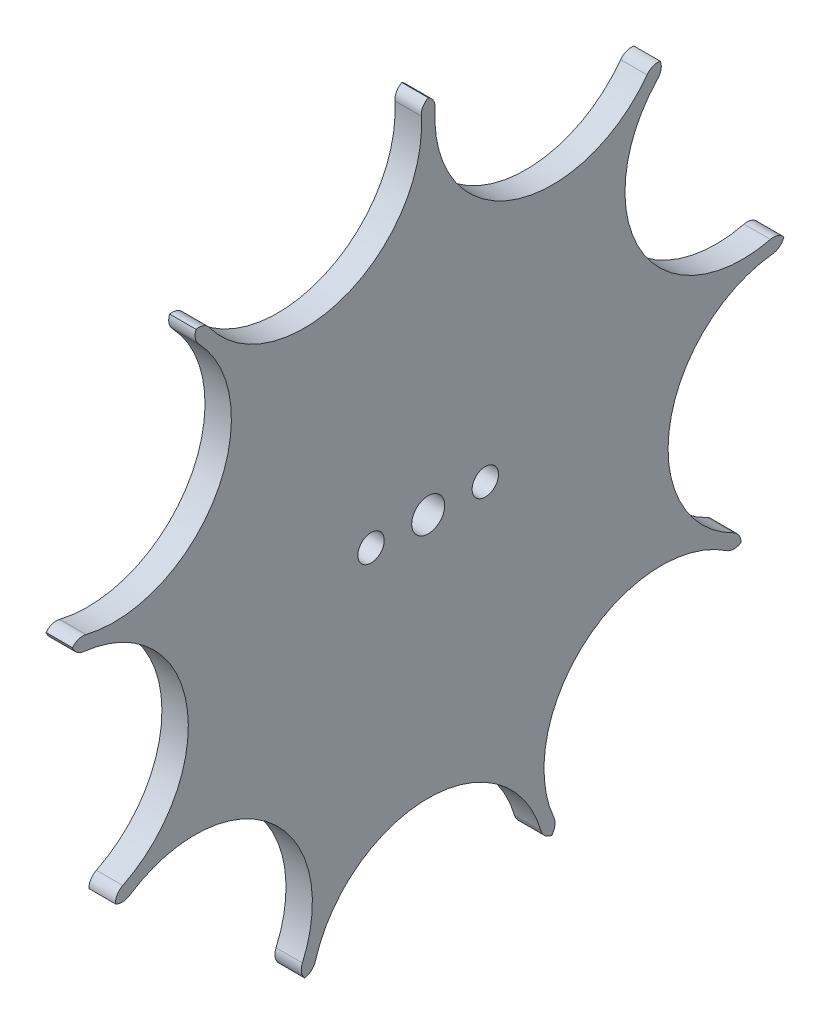
ISO-10303-21;
HEADER;
FILE_DESCRIPTION(('STEP AP214'),'2;1');
FILE_NAME('part.step','',(''),(''),'','','');
FILE_SCHEMA(('AUTOMOTIVE_DESIGN { 1 0 10303 214 1 1 1 1 }'));
ENDSEC;
DATA;
#1=APPLICATION_CONTEXT('core data for automotive mechanical design processes');
#2=APPLICATION_PROTOCOL_DEFINITION('international standard','automotive_design',2000,#1);
#3=PRODUCT_CONTEXT('',#1,'mechanical');
#4=PRODUCT('Part','Part','',(#3));
#5=PRODUCT_RELATED_PRODUCT_CATEGORY('part','',(#4));
#6=PRODUCT_DEFINITION_FORMATION('','',#4);
#7=PRODUCT_DEFINITION_CONTEXT('part definition',#1,'design');
#8=PRODUCT_DEFINITION('design','',#6,#7);
#9=PRODUCT_DEFINITION_SHAPE('','',#8);
#10=(LENGTH_UNIT() NAMED_UNIT(*) SI_UNIT(.MILLI.,.METRE.));
#11=(NAMED_UNIT(*) PLANE_ANGLE_UNIT() SI_UNIT($,.RADIAN.));
#12=(NAMED_UNIT(*) SI_UNIT($,.STERADIAN.) SOLID_ANGLE_UNIT());
#13=UNCERTAINTY_MEASURE_WITH_UNIT(LENGTH_MEASURE(1.E-05),#10,'distance_accuracy_value','');
#14=(GEOMETRIC_REPRESENTATION_CONTEXT(3) GLOBAL_UNCERTAINTY_ASSIGNED_CONTEXT((#13)) GLOBAL_UNIT_ASSIGNED_CONTEXT((#10,
#11,#12)) REPRESENTATION_CONTEXT('',''));
#15=CARTESIAN_POINT('',(0.,0.,0.));
#16=DIRECTION('',(0.,0.,1.));
#17=DIRECTION('',(1.,0.,0.));
#18=AXIS2_PLACEMENT_3D('',#15,#16,#17);
#19=CARTESIAN_POINT('',(1.27,0.,0.));
#20=DIRECTION('',(1.,0.,0.));
#21=DIRECTION('',(0.,0.,-1.));
#22=AXIS2_PLACEMENT_3D('',#19,#20,#21);
#23=PLANE('',#22);
#24=CARTESIAN_POINT('',(1.27,0.,5.5));
#25=DIRECTION('',(1.,0.,0.));
#26=DIRECTION('',(0.,0.,-1.));
#27=AXIS2_PLACEMENT_3D('',#24,#25,#26);
#28=CIRCLE('',#27,1.27);
#29=CARTESIAN_POINT('',(1.27,0.,4.23));
#30=VERTEX_POINT('',#29);
#31=EDGE_CURVE('E869',#30,#30,#28,.T.);
#32=ORIENTED_EDGE('',*,*,#31,.F.);
#33=EDGE_LOOP('',(#32));
#34=FACE_BOUND('',#33,.T.);
#35=CARTESIAN_POINT('',(1.27,0.,-5.5));
#36=DIRECTION('',(1.,0.,0.));
#37=DIRECTION('',(0.,0.,-1.));
#38=AXIS2_PLACEMENT_3D('',#35,#36,#37);
#39=CIRCLE('',#38,1.27);
#40=CARTESIAN_POINT('',(1.27,0.,-6.77));
#41=VERTEX_POINT('',#40);
#42=EDGE_CURVE('E870',#41,#41,#39,.T.);
#43=ORIENTED_EDGE('',*,*,#42,.F.);
#44=EDGE_LOOP('',(#43));
#45=FACE_BOUND('',#44,.T.);
#46=CARTESIAN_POINT('',(1.27,0.,0.));
#47=DIRECTION('',(1.,0.,0.));
#48=DIRECTION('',(0.,0.,-1.));
#49=AXIS2_PLACEMENT_3D('',#46,#47,#48);
#50=CIRCLE('',#49,1.5875);
#51=CARTESIAN_POINT('',(1.27,0.,-1.5875));
#52=VERTEX_POINT('',#51);
#53=EDGE_CURVE('E352',#52,#52,#50,.T.);
#54=ORIENTED_EDGE('',*,*,#53,.F.);
#55=EDGE_LOOP('',(#54));
#56=FACE_BOUND('',#55,.T.);
#57=CARTESIAN_POINT('',(1.27,26.163091805797,-21.1695926309752));
#58=DIRECTION('',(1.,0.,0.));
#59=DIRECTION('',(0.,0.,-1.));
#60=AXIS2_PLACEMENT_3D('',#57,#58,#59);
#61=CIRCLE('',#60,1.27);
#62=CARTESIAN_POINT('',(1.27,25.2842441486458,-22.0863951154395));
#63=VERTEX_POINT('',#62);
#64=CARTESIAN_POINT('',(1.27,26.6343886454625,-22.3489056890396));
#65=VERTEX_POINT('',#64);
#66=EDGE_CURVE('E254',#63,#65,#61,.T.);
#67=ORIENTED_EDGE('',*,*,#66,.T.);
#68=CARTESIAN_POINT('',(1.27,25.391152165304,-22.0895544707986));
#69=DIRECTION('',(1.,0.,0.));
#70=DIRECTION('',(0.,0.,-1.));
#71=AXIS2_PLACEMENT_3D('',#68,#69,#70);
#72=CIRCLE('',#71,1.27);
#73=CARTESIAN_POINT('',(1.27,26.141416065874,-21.0648574036118));
#74=VERTEX_POINT('',#73);
#75=EDGE_CURVE('E256',#65,#74,#72,.T.);
#76=ORIENTED_EDGE('',*,*,#75,.T.);
#77=CARTESIAN_POINT('',(1.27,32.8187647809479,-11.9450535056488));
#78=DIRECTION('',(1.,0.,0.));
#79=DIRECTION('',(0.,0.,-1.));
#80=AXIS2_PLACEMENT_3D('',#77,#78,#79);
#81=CIRCLE('',#80,11.303);
#82=CARTESIAN_POINT('',(1.27,33.5657158513794,-0.666761387673595));
#83=VERTEX_POINT('',#82);
#84=EDGE_CURVE('E237',#83,#74,#81,.T.);
#85=ORIENTED_EDGE('',*,*,#84,.F.);
#86=CARTESIAN_POINT('',(1.27,33.6496429379448,0.60046244580675));
#87=DIRECTION('',(1.,0.,0.));
#88=DIRECTION('',(0.,0.,-1.));
#89=AXIS2_PLACEMENT_3D('',#86,#87,#88);
#90=CIRCLE('',#89,1.27);
#91=CARTESIAN_POINT('',(1.27,34.7687250846954,2.37765536426071E-13));
#92=VERTEX_POINT('',#91);
#93=EDGE_CURVE('E246',#83,#92,#90,.T.);
#94=ORIENTED_EDGE('',*,*,#93,.T.);
#95=CARTESIAN_POINT('',(1.27,33.6496429379448,-0.600462445806291));
#96=DIRECTION('',(1.,0.,0.));
#97=DIRECTION('',(0.,0.,-1.));
#98=AXIS2_PLACEMENT_3D('',#95,#96,#97);
#99=CIRCLE('',#98,1.27);
#100=CARTESIAN_POINT('',(1.27,33.5657158513794,0.666761387674054));
#101=VERTEX_POINT('',#100);
#102=EDGE_CURVE('E235',#92,#101,#99,.T.);
#103=ORIENTED_EDGE('',*,*,#102,.T.);
#104=CARTESIAN_POINT('',(1.27,32.8187647809478,11.9450535056492));
#105=DIRECTION('',(1.,0.,0.));
#106=DIRECTION('',(0.,0.,-1.));
#107=AXIS2_PLACEMENT_3D('',#104,#105,#106);
#108=CIRCLE('',#107,11.303);
#109=CARTESIAN_POINT('',(1.27,26.1414160658738,21.0648574036121));
#110=VERTEX_POINT('',#109);
#111=EDGE_CURVE('E222',#110,#101,#108,.T.);
#112=ORIENTED_EDGE('',*,*,#111,.F.);
#113=CARTESIAN_POINT('',(1.27,25.3911521653037,22.089554470799));
#114=DIRECTION('',(1.,0.,0.));
#115=DIRECTION('',(0.,0.,-1.));
#116=AXIS2_PLACEMENT_3D('',#113,#114,#115);
#117=CIRCLE('',#116,1.27);
#118=CARTESIAN_POINT('',(1.27,26.6343886454622,22.34890568904));
#119=VERTEX_POINT('',#118);
#120=EDGE_CURVE('E232',#110,#119,#117,.T.);
#121=ORIENTED_EDGE('',*,*,#120,.T.);
#122=CARTESIAN_POINT('',(1.27,26.1630918057967,21.1695926309756));
#123=DIRECTION('',(1.,0.,0.));
#124=DIRECTION('',(0.,0.,-1.));
#125=AXIS2_PLACEMENT_3D('',#122,#123,#124);
#126=CIRCLE('',#125,1.27);
#127=CARTESIAN_POINT('',(1.27,25.2842441486455,22.0863951154398));
#128=VERTEX_POINT('',#127);
#129=EDGE_CURVE('E243',#119,#128,#126,.T.);
#130=ORIENTED_EDGE('',*,*,#129,.T.);
#131=CARTESIAN_POINT('',(1.27,17.4624999999997,30.2459372271717));
#132=DIRECTION('',(1.,0.,0.));
#133=DIRECTION('',(0.,0.,-1.));
#134=AXIS2_PLACEMENT_3D('',#131,#132,#133);
#135=CIRCLE('',#134,11.303);
#136=CARTESIAN_POINT('',(1.27,6.48525717366806,32.9399953059351));
#137=VERTEX_POINT('',#136);
#138=EDGE_CURVE('E368',#137,#128,#135,.T.);
#139=ORIENTED_EDGE('',*,*,#138,.F.);
#140=CARTESIAN_POINT('',(1.27,5.25185910329373,33.2426984608523));
#141=DIRECTION('',(1.,0.,0.));
#142=DIRECTION('',(0.,0.,-1.));
#143=AXIS2_PLACEMENT_3D('',#140,#141,#142);
#144=CIRCLE('',#143,1.27);
#145=CARTESIAN_POINT('',(1.27,6.03752575075951,34.2405100257581));
#146=VERTEX_POINT('',#145);
#147=EDGE_CURVE('E244',#137,#146,#144,.T.);
#148=ORIENTED_EDGE('',*,*,#147,.T.);
#149=CARTESIAN_POINT('',(1.27,6.43453924733961,33.0341600419088));
#150=DIRECTION('',(1.,0.,0.));
#151=DIRECTION('',(0.,0.,-1.));
#152=AXIS2_PLACEMENT_3D('',#149,#150,#151);
#153=CIRCLE('',#152,1.27);
#154=CARTESIAN_POINT('',(1.27,5.17199360568735,33.1715591057515));
#155=VERTEX_POINT('',#154);
#156=EDGE_CURVE('E248',#146,#155,#153,.T.);
#157=ORIENTED_EDGE('',*,*,#156,.T.);
#158=CARTESIAN_POINT('',(1.27,-6.0646626050179,34.3944107739513));
#159=DIRECTION('',(1.,0.,0.));
#160=DIRECTION('',(0.,0.,-1.));
#161=AXIS2_PLACEMENT_3D('',#158,#159,#160);
#162=CIRCLE('',#161,11.303);
#163=CARTESIAN_POINT('',(1.27,-16.2054256257019,29.4021433173413));
#164=VERTEX_POINT('',#163);
#165=EDGE_CURVE('E371',#164,#155,#162,.T.);
#166=ORIENTED_EDGE('',*,*,#165,.F.);
#167=CARTESIAN_POINT('',(1.27,-17.3448372010597,28.8412143896323));
#168=DIRECTION('',(1.,0.,0.));
#169=DIRECTION('',(0.,0.,-1.));
#170=AXIS2_PLACEMENT_3D('',#167,#168,#169);
#171=CIRCLE('',#170,1.27);
#172=CARTESIAN_POINT('',(1.27,-17.3843625423481,30.1105991805433));
#173=VERTEX_POINT('',#172);
#174=EDGE_CURVE('E429',#164,#173,#171,.T.);
#175=ORIENTED_EDGE('',*,*,#174,.T.);
#176=CARTESIAN_POINT('',(1.27,-16.3048057368857,29.4416768354389));
#177=DIRECTION('',(1.,0.,0.));
#178=DIRECTION('',(0.,0.,-1.));
#179=AXIS2_PLACEMENT_3D('',#176,#177,#178);
#180=CIRCLE('',#179,1.27);
#181=CARTESIAN_POINT('',(1.27,-17.3602902256781,28.7353819296675));
#182=VERTEX_POINT('',#181);
#183=EDGE_CURVE('E427',#173,#182,#180,.T.);
#184=ORIENTED_EDGE('',*,*,#183,.T.);
#185=CARTESIAN_POINT('',(1.27,-26.7541021759306,22.4493572683021));
#186=DIRECTION('',(1.,0.,0.));
#187=DIRECTION('',(0.,0.,-1.));
#188=AXIS2_PLACEMENT_3D('',#185,#186,#187);
#189=CIRCLE('',#188,11.303);
#190=CARTESIAN_POINT('',(1.27,-31.3134096715618,12.1067017021391));
#191=VERTEX_POINT('',#190);
#192=EDGE_CURVE('E374',#191,#182,#189,.T.);
#193=ORIENTED_EDGE('',*,*,#192,.F.);
#194=CARTESIAN_POINT('',(1.27,-31.8256914126439,10.9446055711096));
#195=DIRECTION('',(1.,0.,0.));
#196=DIRECTION('',(0.,0.,-1.));
#197=AXIS2_PLACEMENT_3D('',#194,#195,#196);
#198=CIRCLE('',#197,1.27);
#199=CARTESIAN_POINT('',(1.27,-32.6719143962221,11.8916043367181));
#200=VERTEX_POINT('',#199);
#201=EDGE_CURVE('E425',#191,#200,#198,.T.);
#202=ORIENTED_EDGE('',*,*,#201,.T.);
#203=CARTESIAN_POINT('',(1.27,-31.4149509090909,12.0731058298769));
#204=DIRECTION('',(1.,0.,0.));
#205=DIRECTION('',(0.,0.,-1.));
#206=AXIS2_PLACEMENT_3D('',#203,#204,#205);
#207=CIRCLE('',#206,1.27);
#208=CARTESIAN_POINT('',(1.27,-31.769501322314,10.8536001904954));
#209=VERTEX_POINT('',#208);
#210=EDGE_CURVE('E423',#200,#209,#207,.T.);
#211=ORIENTED_EDGE('',*,*,#210,.T.);
#212=CARTESIAN_POINT('',(1.27,-34.925,0.));
#213=DIRECTION('',(1.,0.,0.));
#214=DIRECTION('',(0.,0.,-1.));
#215=AXIS2_PLACEMENT_3D('',#212,#213,#214);
#216=CIRCLE('',#215,11.303);
#217=CARTESIAN_POINT('',(1.27,-31.769501322314,-10.8536001904954));
#218=VERTEX_POINT('',#217);
#219=EDGE_CURVE('E236',#218,#209,#216,.T.);
#220=ORIENTED_EDGE('',*,*,#219,.F.);
#221=CARTESIAN_POINT('',(1.27,-31.4149509090909,-12.0731058298769));
#222=DIRECTION('',(1.,0.,0.));
#223=DIRECTION('',(0.,0.,-1.));
#224=AXIS2_PLACEMENT_3D('',#221,#222,#223);
#225=CIRCLE('',#224,1.27);
#226=CARTESIAN_POINT('',(1.27,-32.6719143962222,-11.8916043367183));
#227=VERTEX_POINT('',#226);
#228=EDGE_CURVE('E421',#218,#227,#225,.T.);
#229=ORIENTED_EDGE('',*,*,#228,.T.);
#230=CARTESIAN_POINT('',(1.27,-31.8256914126438,-10.94460557111));
#231=DIRECTION('',(1.,0.,0.));
#232=DIRECTION('',(0.,0.,-1.));
#233=AXIS2_PLACEMENT_3D('',#230,#231,#232);
#234=CIRCLE('',#233,1.27);
#235=CARTESIAN_POINT('',(1.27,-31.3134096715616,-12.1067017021396));
#236=VERTEX_POINT('',#235);
#237=EDGE_CURVE('E419',#227,#236,#234,.T.);
#238=ORIENTED_EDGE('',*,*,#237,.T.);
#239=CARTESIAN_POINT('',(1.27,-26.7541021759303,-22.4493572683024));
#240=DIRECTION('',(1.,0.,0.));
#241=DIRECTION('',(0.,0.,-1.));
#242=AXIS2_PLACEMENT_3D('',#239,#240,#241);
#243=CIRCLE('',#242,11.303);
#244=CARTESIAN_POINT('',(1.27,-17.3602902256777,-28.7353819296677));
#245=VERTEX_POINT('',#244);
#246=EDGE_CURVE('E331',#245,#236,#243,.T.);
#247=ORIENTED_EDGE('',*,*,#246,.F.);
#248=CARTESIAN_POINT('',(1.27,-16.3048057368853,-29.4416768354391));
#249=DIRECTION('',(1.,0.,0.));
#250=DIRECTION('',(0.,0.,-1.));
#251=AXIS2_PLACEMENT_3D('',#248,#249,#250);
#252=CIRCLE('',#251,1.27);
#253=CARTESIAN_POINT('',(1.27,-17.3843625423476,-30.1105991805435));
#254=VERTEX_POINT('',#253);
#255=EDGE_CURVE('E415',#245,#254,#252,.T.);
#256=ORIENTED_EDGE('',*,*,#255,.T.);
#257=CARTESIAN_POINT('',(1.27,-17.3448372010593,-28.8412143896326));
#258=DIRECTION('',(1.,0.,0.));
#259=DIRECTION('',(0.,0.,-1.));
#260=AXIS2_PLACEMENT_3D('',#257,#258,#259);
#261=CIRCLE('',#260,1.27);
#262=CARTESIAN_POINT('',(1.27,-16.2054256257015,-29.4021433173415));
#263=VERTEX_POINT('',#262);
#264=EDGE_CURVE('E417',#254,#263,#261,.T.);
#265=ORIENTED_EDGE('',*,*,#264,.T.);
#266=CARTESIAN_POINT('',(1.27,-6.06466260501743,-34.3944107739514));
#267=DIRECTION('',(1.,0.,0.));
#268=DIRECTION('',(0.,0.,-1.));
#269=AXIS2_PLACEMENT_3D('',#266,#267,#268);
#270=CIRCLE('',#269,11.303);
#271=CARTESIAN_POINT('',(1.27,5.1719936056878,-33.1715591057514));
#272=VERTEX_POINT('',#271);
#273=EDGE_CURVE('E377',#272,#263,#270,.T.);
#274=ORIENTED_EDGE('',*,*,#273,.F.);
#275=CARTESIAN_POINT('',(1.27,6.43453924734006,-33.0341600419087));
#276=DIRECTION('',(1.,0.,0.));
#277=DIRECTION('',(0.,0.,-1.));
#278=AXIS2_PLACEMENT_3D('',#275,#276,#277);
#279=CIRCLE('',#278,1.27);
#280=CARTESIAN_POINT('',(1.27,6.03752575075998,-34.2405100257581));
#281=VERTEX_POINT('',#280);
#282=EDGE_CURVE('E413',#272,#281,#279,.T.);
#283=ORIENTED_EDGE('',*,*,#282,.T.);
#284=CARTESIAN_POINT('',(1.27,5.2518591032942,-33.2426984608522));
#285=DIRECTION('',(1.,0.,0.));
#286=DIRECTION('',(0.,0.,-1.));
#287=AXIS2_PLACEMENT_3D('',#284,#285,#286);
#288=CIRCLE('',#287,1.27);
#289=CARTESIAN_POINT('',(1.27,6.48525717366853,-32.939995305935));
#290=VERTEX_POINT('',#289);
#291=EDGE_CURVE('E411',#281,#290,#288,.T.);
#292=ORIENTED_EDGE('',*,*,#291,.T.);
#293=CARTESIAN_POINT('',(1.27,17.4625000000001,-30.2459372271714));
#294=DIRECTION('',(1.,0.,0.));
#295=DIRECTION('',(0.,0.,-1.));
#296=AXIS2_PLACEMENT_3D('',#293,#294,#295);
#297=CIRCLE('',#296,11.303);
#298=EDGE_CURVE('E380',#63,#290,#297,.T.);
#299=ORIENTED_EDGE('',*,*,#298,.F.);
#300=EDGE_LOOP('',(#67,#76,#85,#94,#103,#112,#121,#130,#139,#148,#157,#166,#175,#184,#193,#202,
#211,#220,#229,#238,#247,#256,#265,#274,#283,#292,#299));
#301=FACE_BOUND('',#300,.T.);
#302=ADVANCED_FACE('F37',(#34,#45,#56,#301),#23,.T.);
#303=CARTESIAN_POINT('',(-1.27,0.,0.));
#304=DIRECTION('',(1.,0.,0.));
#305=DIRECTION('',(0.,0.,-1.));
#306=AXIS2_PLACEMENT_3D('',#303,#304,#305);
#307=PLANE('',#306);
#308=CARTESIAN_POINT('',(-1.27,0.,5.5));
#309=DIRECTION('',(1.,0.,0.));
#310=DIRECTION('',(0.,0.,-1.));
#311=AXIS2_PLACEMENT_3D('',#308,#309,#310);
#312=CIRCLE('',#311,1.27);
#313=CARTESIAN_POINT('',(-1.27,0.,4.23));
#314=VERTEX_POINT('',#313);
#315=EDGE_CURVE('E361',#314,#314,#312,.T.);
#316=ORIENTED_EDGE('',*,*,#315,.T.);
#317=EDGE_LOOP('',(#316));
#318=FACE_BOUND('',#317,.T.);
#319=CARTESIAN_POINT('',(-1.27,0.,-5.5));
#320=DIRECTION('',(1.,0.,0.));
#321=DIRECTION('',(0.,0.,-1.));
#322=AXIS2_PLACEMENT_3D('',#319,#320,#321);
#323=CIRCLE('',#322,1.27);
#324=CARTESIAN_POINT('',(-1.27,0.,-6.77));
#325=VERTEX_POINT('',#324);
#326=EDGE_CURVE('E364',#325,#325,#323,.T.);
#327=ORIENTED_EDGE('',*,*,#326,.T.);
#328=EDGE_LOOP('',(#327));
#329=FACE_BOUND('',#328,.T.);
#330=CARTESIAN_POINT('',(-1.27,0.,0.));
#331=DIRECTION('',(1.,0.,0.));
#332=DIRECTION('',(0.,0.,-1.));
#333=AXIS2_PLACEMENT_3D('',#330,#331,#332);
#334=CIRCLE('',#333,1.5875);
#335=CARTESIAN_POINT('',(-1.27,0.,-1.5875));
#336=VERTEX_POINT('',#335);
#337=EDGE_CURVE('E41',#336,#336,#334,.T.);
#338=ORIENTED_EDGE('',*,*,#337,.T.);
#339=EDGE_LOOP('',(#338));
#340=FACE_BOUND('',#339,.T.);
#341=CARTESIAN_POINT('',(-1.27,32.8187647809479,-11.9450535056488));
#342=DIRECTION('',(1.,0.,0.));
#343=DIRECTION('',(0.,0.,-1.));
#344=AXIS2_PLACEMENT_3D('',#341,#342,#343);
#345=CIRCLE('',#344,11.303);
#346=CARTESIAN_POINT('',(-1.27,33.5657158513794,-0.666761387673595));
#347=VERTEX_POINT('',#346);
#348=CARTESIAN_POINT('',(-1.27,26.141416065874,-21.0648574036118));
#349=VERTEX_POINT('',#348);
#350=EDGE_CURVE('E408',#347,#349,#345,.T.);
#351=ORIENTED_EDGE('',*,*,#350,.T.);
#352=CARTESIAN_POINT('',(-1.27,25.391152165304,-22.0895544707986));
#353=DIRECTION('',(1.,0.,0.));
#354=DIRECTION('',(0.,0.,-1.));
#355=AXIS2_PLACEMENT_3D('',#352,#353,#354);
#356=CIRCLE('',#355,1.27);
#357=CARTESIAN_POINT('',(-1.27,26.6343886454625,-22.3489056890396));
#358=VERTEX_POINT('',#357);
#359=EDGE_CURVE('E54',#349,#358,#356,.F.);
#360=ORIENTED_EDGE('',*,*,#359,.T.);
#361=CARTESIAN_POINT('',(-1.27,26.163091805797,-21.1695926309752));
#362=DIRECTION('',(1.,0.,0.));
#363=DIRECTION('',(0.,0.,-1.));
#364=AXIS2_PLACEMENT_3D('',#361,#362,#363);
#365=CIRCLE('',#364,1.27);
#366=CARTESIAN_POINT('',(-1.27,25.2842441486458,-22.0863951154395));
#367=VERTEX_POINT('',#366);
#368=EDGE_CURVE('E294',#358,#367,#365,.F.);
#369=ORIENTED_EDGE('',*,*,#368,.T.);
#370=CARTESIAN_POINT('',(-1.27,17.4625000000001,-30.2459372271714));
#371=DIRECTION('',(1.,0.,0.));
#372=DIRECTION('',(0.,0.,-1.));
#373=AXIS2_PLACEMENT_3D('',#370,#371,#372);
#374=CIRCLE('',#373,11.303);
#375=CARTESIAN_POINT('',(-1.27,6.48525717366853,-32.939995305935));
#376=VERTEX_POINT('',#375);
#377=EDGE_CURVE('E405',#367,#376,#374,.T.);
#378=ORIENTED_EDGE('',*,*,#377,.T.);
#379=CARTESIAN_POINT('',(-1.27,5.2518591032942,-33.2426984608522));
#380=DIRECTION('',(1.,0.,0.));
#381=DIRECTION('',(0.,0.,-1.));
#382=AXIS2_PLACEMENT_3D('',#379,#380,#381);
#383=CIRCLE('',#382,1.27);
#384=CARTESIAN_POINT('',(-1.27,6.03752575075998,-34.2405100257581));
#385=VERTEX_POINT('',#384);
#386=EDGE_CURVE('E263',#376,#385,#383,.F.);
#387=ORIENTED_EDGE('',*,*,#386,.T.);
#388=CARTESIAN_POINT('',(-1.27,6.43453924734006,-33.0341600419087));
#389=DIRECTION('',(1.,0.,0.));
#390=DIRECTION('',(0.,0.,-1.));
#391=AXIS2_PLACEMENT_3D('',#388,#389,#390);
#392=CIRCLE('',#391,1.27);
#393=CARTESIAN_POINT('',(-1.27,5.1719936056878,-33.1715591057514));
#394=VERTEX_POINT('',#393);
#395=EDGE_CURVE('E265',#385,#394,#392,.F.);
#396=ORIENTED_EDGE('',*,*,#395,.T.);
#397=CARTESIAN_POINT('',(-1.27,-6.06466260501743,-34.3944107739514));
#398=DIRECTION('',(1.,0.,0.));
#399=DIRECTION('',(0.,0.,-1.));
#400=AXIS2_PLACEMENT_3D('',#397,#398,#399);
#401=CIRCLE('',#400,11.303);
#402=CARTESIAN_POINT('',(-1.27,-16.2054256257015,-29.4021433173415));
#403=VERTEX_POINT('',#402);
#404=EDGE_CURVE('E402',#394,#403,#401,.T.);
#405=ORIENTED_EDGE('',*,*,#404,.T.);
#406=CARTESIAN_POINT('',(-1.27,-17.3448372010593,-28.8412143896326));
#407=DIRECTION('',(1.,0.,0.));
#408=DIRECTION('',(0.,0.,-1.));
#409=AXIS2_PLACEMENT_3D('',#406,#407,#408);
#410=CIRCLE('',#409,1.27);
#411=CARTESIAN_POINT('',(-1.27,-17.3843625423476,-30.1105991805435));
#412=VERTEX_POINT('',#411);
#413=EDGE_CURVE('E269',#403,#412,#410,.F.);
#414=ORIENTED_EDGE('',*,*,#413,.T.);
#415=CARTESIAN_POINT('',(-1.27,-16.3048057368853,-29.4416768354391));
#416=DIRECTION('',(1.,0.,0.));
#417=DIRECTION('',(0.,0.,-1.));
#418=AXIS2_PLACEMENT_3D('',#415,#416,#417);
#419=CIRCLE('',#418,1.27);
#420=CARTESIAN_POINT('',(-1.27,-17.3602902256777,-28.7353819296677));
#421=VERTEX_POINT('',#420);
#422=EDGE_CURVE('E267',#412,#421,#419,.F.);
#423=ORIENTED_EDGE('',*,*,#422,.T.);
#424=CARTESIAN_POINT('',(-1.27,-26.7541021759303,-22.4493572683024));
#425=DIRECTION('',(1.,0.,0.));
#426=DIRECTION('',(0.,0.,-1.));
#427=AXIS2_PLACEMENT_3D('',#424,#425,#426);
#428=CIRCLE('',#427,11.303);
#429=CARTESIAN_POINT('',(-1.27,-31.3134096715616,-12.1067017021396));
#430=VERTEX_POINT('',#429);
#431=EDGE_CURVE('E390',#421,#430,#428,.T.);
#432=ORIENTED_EDGE('',*,*,#431,.T.);
#433=CARTESIAN_POINT('',(-1.27,-31.8256914126438,-10.94460557111));
#434=DIRECTION('',(1.,0.,0.));
#435=DIRECTION('',(0.,0.,-1.));
#436=AXIS2_PLACEMENT_3D('',#433,#434,#435);
#437=CIRCLE('',#436,1.27);
#438=CARTESIAN_POINT('',(-1.27,-32.6719143962222,-11.8916043367183));
#439=VERTEX_POINT('',#438);
#440=EDGE_CURVE('E271',#430,#439,#437,.F.);
#441=ORIENTED_EDGE('',*,*,#440,.T.);
#442=CARTESIAN_POINT('',(-1.27,-31.4149509090909,-12.0731058298769));
#443=DIRECTION('',(1.,0.,0.));
#444=DIRECTION('',(0.,0.,-1.));
#445=AXIS2_PLACEMENT_3D('',#442,#443,#444);
#446=CIRCLE('',#445,1.27);
#447=CARTESIAN_POINT('',(-1.27,-31.769501322314,-10.8536001904954));
#448=VERTEX_POINT('',#447);
#449=EDGE_CURVE('E273',#439,#448,#446,.F.);
#450=ORIENTED_EDGE('',*,*,#449,.T.);
#451=CARTESIAN_POINT('',(-1.27,-34.925,0.));
#452=DIRECTION('',(1.,0.,0.));
#453=DIRECTION('',(0.,0.,-1.));
#454=AXIS2_PLACEMENT_3D('',#451,#452,#453);
#455=CIRCLE('',#454,11.303);
#456=CARTESIAN_POINT('',(-1.27,-31.769501322314,10.8536001904954));
#457=VERTEX_POINT('',#456);
#458=EDGE_CURVE('E387',#448,#457,#455,.T.);
#459=ORIENTED_EDGE('',*,*,#458,.T.);
#460=CARTESIAN_POINT('',(-1.27,-31.4149509090909,12.0731058298769));
#461=DIRECTION('',(1.,0.,0.));
#462=DIRECTION('',(0.,0.,-1.));
#463=AXIS2_PLACEMENT_3D('',#460,#461,#462);
#464=CIRCLE('',#463,1.27);
#465=CARTESIAN_POINT('',(-1.27,-32.6719143962221,11.8916043367181));
#466=VERTEX_POINT('',#465);
#467=EDGE_CURVE('E275',#457,#466,#464,.F.);
#468=ORIENTED_EDGE('',*,*,#467,.T.);
#469=CARTESIAN_POINT('',(-1.27,-31.8256914126439,10.9446055711096));
#470=DIRECTION('',(1.,0.,0.));
#471=DIRECTION('',(0.,0.,-1.));
#472=AXIS2_PLACEMENT_3D('',#469,#470,#471);
#473=CIRCLE('',#472,1.27);
#474=CARTESIAN_POINT('',(-1.27,-31.3134096715618,12.1067017021391));
#475=VERTEX_POINT('',#474);
#476=EDGE_CURVE('E277',#466,#475,#473,.F.);
#477=ORIENTED_EDGE('',*,*,#476,.T.);
#478=CARTESIAN_POINT('',(-1.27,-26.7541021759306,22.4493572683021));
#479=DIRECTION('',(1.,0.,0.));
#480=DIRECTION('',(0.,0.,-1.));
#481=AXIS2_PLACEMENT_3D('',#478,#479,#480);
#482=CIRCLE('',#481,11.303);
#483=CARTESIAN_POINT('',(-1.27,-17.3602902256781,28.7353819296675));
#484=VERTEX_POINT('',#483);
#485=EDGE_CURVE('E399',#475,#484,#482,.T.);
#486=ORIENTED_EDGE('',*,*,#485,.T.);
#487=CARTESIAN_POINT('',(-1.27,-16.3048057368857,29.4416768354389));
#488=DIRECTION('',(1.,0.,0.));
#489=DIRECTION('',(0.,0.,-1.));
#490=AXIS2_PLACEMENT_3D('',#487,#488,#489);
#491=CIRCLE('',#490,1.27);
#492=CARTESIAN_POINT('',(-1.27,-17.3843625423481,30.1105991805433));
#493=VERTEX_POINT('',#492);
#494=EDGE_CURVE('E279',#484,#493,#491,.F.);
#495=ORIENTED_EDGE('',*,*,#494,.T.);
#496=CARTESIAN_POINT('',(-1.27,-17.3448372010597,28.8412143896323));
#497=DIRECTION('',(1.,0.,0.));
#498=DIRECTION('',(0.,0.,-1.));
#499=AXIS2_PLACEMENT_3D('',#496,#497,#498);
#500=CIRCLE('',#499,1.27);
#501=CARTESIAN_POINT('',(-1.27,-16.2054256257019,29.4021433173413));
#502=VERTEX_POINT('',#501);
#503=EDGE_CURVE('E281',#493,#502,#500,.F.);
#504=ORIENTED_EDGE('',*,*,#503,.T.);
#505=CARTESIAN_POINT('',(-1.27,-6.0646626050179,34.3944107739513));
#506=DIRECTION('',(1.,0.,0.));
#507=DIRECTION('',(0.,0.,-1.));
#508=AXIS2_PLACEMENT_3D('',#505,#506,#507);
#509=CIRCLE('',#508,11.303);
#510=CARTESIAN_POINT('',(-1.27,5.17199360568735,33.1715591057515));
#511=VERTEX_POINT('',#510);
#512=EDGE_CURVE('E396',#502,#511,#509,.T.);
#513=ORIENTED_EDGE('',*,*,#512,.T.);
#514=CARTESIAN_POINT('',(-1.27,6.43453924733961,33.0341600419088));
#515=DIRECTION('',(1.,0.,0.));
#516=DIRECTION('',(0.,0.,-1.));
#517=AXIS2_PLACEMENT_3D('',#514,#515,#516);
#518=CIRCLE('',#517,1.27);
#519=CARTESIAN_POINT('',(-1.27,6.03752575075951,34.2405100257581));
#520=VERTEX_POINT('',#519);
#521=EDGE_CURVE('E283',#511,#520,#518,.F.);
#522=ORIENTED_EDGE('',*,*,#521,.T.);
#523=CARTESIAN_POINT('',(-1.27,5.25185910329373,33.2426984608523));
#524=DIRECTION('',(1.,0.,0.));
#525=DIRECTION('',(0.,0.,-1.));
#526=AXIS2_PLACEMENT_3D('',#523,#524,#525);
#527=CIRCLE('',#526,1.27);
#528=CARTESIAN_POINT('',(-1.27,6.48525717366806,32.9399953059351));
#529=VERTEX_POINT('',#528);
#530=EDGE_CURVE('E285',#520,#529,#527,.F.);
#531=ORIENTED_EDGE('',*,*,#530,.T.);
#532=CARTESIAN_POINT('',(-1.27,17.4624999999997,30.2459372271717));
#533=DIRECTION('',(1.,0.,0.));
#534=DIRECTION('',(0.,0.,-1.));
#535=AXIS2_PLACEMENT_3D('',#532,#533,#534);
#536=CIRCLE('',#535,11.303);
#537=CARTESIAN_POINT('',(-1.27,25.2842441486455,22.0863951154398));
#538=VERTEX_POINT('',#537);
#539=EDGE_CURVE('E393',#529,#538,#536,.T.);
#540=ORIENTED_EDGE('',*,*,#539,.T.);
#541=CARTESIAN_POINT('',(-1.27,26.1630918057967,21.1695926309756));
#542=DIRECTION('',(1.,0.,0.));
#543=DIRECTION('',(0.,0.,-1.));
#544=AXIS2_PLACEMENT_3D('',#541,#542,#543);
#545=CIRCLE('',#544,1.27);
#546=CARTESIAN_POINT('',(-1.27,26.6343886454622,22.34890568904));
#547=VERTEX_POINT('',#546);
#548=EDGE_CURVE('E289',#538,#547,#545,.F.);
#549=ORIENTED_EDGE('',*,*,#548,.T.);
#550=CARTESIAN_POINT('',(-1.27,25.3911521653037,22.089554470799));
#551=DIRECTION('',(1.,0.,0.));
#552=DIRECTION('',(0.,0.,-1.));
#553=AXIS2_PLACEMENT_3D('',#550,#551,#552);
#554=CIRCLE('',#553,1.27);
#555=CARTESIAN_POINT('',(-1.27,26.1414160658738,21.0648574036121));
#556=VERTEX_POINT('',#555);
#557=EDGE_CURVE('E287',#547,#556,#554,.F.);
#558=ORIENTED_EDGE('',*,*,#557,.T.);
#559=CARTESIAN_POINT('',(-1.27,32.8187647809478,11.9450535056492));
#560=DIRECTION('',(1.,0.,0.));
#561=DIRECTION('',(0.,0.,-1.));
#562=AXIS2_PLACEMENT_3D('',#559,#560,#561);
#563=CIRCLE('',#562,11.303);
#564=CARTESIAN_POINT('',(-1.27,33.5657158513794,0.666761387674054));
#565=VERTEX_POINT('',#564);
#566=EDGE_CURVE('E224',#556,#565,#563,.T.);
#567=ORIENTED_EDGE('',*,*,#566,.T.);
#568=CARTESIAN_POINT('',(-1.27,33.6496429379448,-0.600462445806291));
#569=DIRECTION('',(1.,0.,0.));
#570=DIRECTION('',(0.,0.,-1.));
#571=AXIS2_PLACEMENT_3D('',#568,#569,#570);
#572=CIRCLE('',#571,1.27);
#573=CARTESIAN_POINT('',(-1.27,34.7687250846954,2.37765536426071E-13));
#574=VERTEX_POINT('',#573);
#575=EDGE_CURVE('E61',#565,#574,#572,.F.);
#576=ORIENTED_EDGE('',*,*,#575,.T.);
#577=CARTESIAN_POINT('',(-1.27,33.6496429379448,0.60046244580675));
#578=DIRECTION('',(1.,0.,0.));
#579=DIRECTION('',(0.,0.,-1.));
#580=AXIS2_PLACEMENT_3D('',#577,#578,#579);
#581=CIRCLE('',#580,1.27);
#582=EDGE_CURVE('E291',#574,#347,#581,.F.);
#583=ORIENTED_EDGE('',*,*,#582,.T.);
#584=EDGE_LOOP('',(#351,#360,#369,#378,#387,#396,#405,#414,#423,#432,#441,#450,#459,#468,#477,
#486,#495,#504,#513,#522,#531,#540,#549,#558,#567,#576,#583));
#585=FACE_BOUND('',#584,.T.);
#586=ADVANCED_FACE('F443',(#318,#329,#340,#585),#307,.F.);
#587=CARTESIAN_POINT('',(-6.35,-34.925,0.));
#588=DIRECTION('',(1.,0.,0.));
#589=DIRECTION('',(0.,0.,-1.));
#590=AXIS2_PLACEMENT_3D('',#587,#588,#589);
#591=CYLINDRICAL_SURFACE('',#590,11.303);
#592=ORIENTED_EDGE('',*,*,#219,.T.);
#593=DIRECTION('',(1.,0.,0.));
#594=VECTOR('',#593,1.);
#595=CARTESIAN_POINT('',(-6.35,-31.769501322314,10.8536001904954));
#596=LINE('',#595,#594);
#597=EDGE_CURVE('E320',#209,#457,#596,.F.);
#598=ORIENTED_EDGE('',*,*,#597,.T.);
#599=ORIENTED_EDGE('',*,*,#458,.F.);
#600=DIRECTION('',(1.,0.,0.));
#601=VECTOR('',#600,1.);
#602=CARTESIAN_POINT('',(-6.35,-31.769501322314,-10.8536001904954));
#603=LINE('',#602,#601);
#604=EDGE_CURVE('E317',#448,#218,#603,.T.);
#605=ORIENTED_EDGE('',*,*,#604,.T.);
#606=EDGE_LOOP('',(#592,#598,#599,#605));
#607=FACE_BOUND('',#606,.T.);
#608=ADVANCED_FACE('F471',(#607),#591,.F.);
#609=CARTESIAN_POINT('',(-6.35,-26.7541021759303,-22.4493572683024));
#610=DIRECTION('',(1.,0.,0.));
#611=DIRECTION('',(0.,0.,-1.));
#612=AXIS2_PLACEMENT_3D('',#609,#610,#611);
#613=CYLINDRICAL_SURFACE('',#612,11.303);
#614=ORIENTED_EDGE('',*,*,#246,.T.);
#615=DIRECTION('',(1.,0.,0.));
#616=VECTOR('',#615,1.);
#617=CARTESIAN_POINT('',(-6.35,-31.3134096715616,-12.1067017021396));
#618=LINE('',#617,#616);
#619=EDGE_CURVE('E324',#236,#430,#618,.F.);
#620=ORIENTED_EDGE('',*,*,#619,.T.);
#621=ORIENTED_EDGE('',*,*,#431,.F.);
#622=DIRECTION('',(1.,0.,0.));
#623=VECTOR('',#622,1.);
#624=CARTESIAN_POINT('',(-6.35,-17.3602902256777,-28.7353819296677));
#625=LINE('',#624,#623);
#626=EDGE_CURVE('E322',#421,#245,#625,.T.);
#627=ORIENTED_EDGE('',*,*,#626,.T.);
#628=EDGE_LOOP('',(#614,#620,#621,#627));
#629=FACE_BOUND('',#628,.T.);
#630=ADVANCED_FACE('F485',(#629),#613,.F.);
#631=CARTESIAN_POINT('',(-6.35,17.4624999999997,30.2459372271717));
#632=DIRECTION('',(1.,0.,0.));
#633=DIRECTION('',(0.,0.,-1.));
#634=AXIS2_PLACEMENT_3D('',#631,#632,#633);
#635=CYLINDRICAL_SURFACE('',#634,11.303);
#636=ORIENTED_EDGE('',*,*,#138,.T.);
#637=DIRECTION('',(1.,0.,0.));
#638=VECTOR('',#637,1.);
#639=CARTESIAN_POINT('',(-6.35,25.2842441486455,22.0863951154398));
#640=LINE('',#639,#638);
#641=EDGE_CURVE('E304',#128,#538,#640,.F.);
#642=ORIENTED_EDGE('',*,*,#641,.T.);
#643=ORIENTED_EDGE('',*,*,#539,.F.);
#644=DIRECTION('',(1.,0.,0.));
#645=VECTOR('',#644,1.);
#646=CARTESIAN_POINT('',(-6.35,6.48525717366806,32.9399953059351));
#647=LINE('',#646,#645);
#648=EDGE_CURVE('E301',#529,#137,#647,.T.);
#649=ORIENTED_EDGE('',*,*,#648,.T.);
#650=EDGE_LOOP('',(#636,#642,#643,#649));
#651=FACE_BOUND('',#650,.T.);
#652=ADVANCED_FACE('F534',(#651),#635,.F.);
#653=CARTESIAN_POINT('',(-6.35,-6.0646626050179,34.3944107739513));
#654=DIRECTION('',(1.,0.,0.));
#655=DIRECTION('',(0.,0.,-1.));
#656=AXIS2_PLACEMENT_3D('',#653,#654,#655);
#657=CYLINDRICAL_SURFACE('',#656,11.303);
#658=ORIENTED_EDGE('',*,*,#165,.T.);
#659=DIRECTION('',(1.,0.,0.));
#660=VECTOR('',#659,1.);
#661=CARTESIAN_POINT('',(-6.35,5.17199360568735,33.1715591057515));
#662=LINE('',#661,#660);
#663=EDGE_CURVE('E310',#155,#511,#662,.F.);
#664=ORIENTED_EDGE('',*,*,#663,.T.);
#665=ORIENTED_EDGE('',*,*,#512,.F.);
#666=DIRECTION('',(1.,0.,0.));
#667=VECTOR('',#666,1.);
#668=CARTESIAN_POINT('',(-6.35,-16.2054256257019,29.4021433173413));
#669=LINE('',#668,#667);
#670=EDGE_CURVE('E307',#502,#164,#669,.T.);
#671=ORIENTED_EDGE('',*,*,#670,.T.);
#672=EDGE_LOOP('',(#658,#664,#665,#671));
#673=FACE_BOUND('',#672,.T.);
#674=ADVANCED_FACE('F437',(#673),#657,.F.);
#675=CARTESIAN_POINT('',(-6.35,-26.7541021759306,22.4493572683021));
#676=DIRECTION('',(1.,0.,0.));
#677=DIRECTION('',(0.,0.,-1.));
#678=AXIS2_PLACEMENT_3D('',#675,#676,#677);
#679=CYLINDRICAL_SURFACE('',#678,11.303);
#680=ORIENTED_EDGE('',*,*,#192,.T.);
#681=DIRECTION('',(1.,0.,0.));
#682=VECTOR('',#681,1.);
#683=CARTESIAN_POINT('',(-6.35,-17.3602902256781,28.7353819296675));
#684=LINE('',#683,#682);
#685=EDGE_CURVE('E315',#182,#484,#684,.F.);
#686=ORIENTED_EDGE('',*,*,#685,.T.);
#687=ORIENTED_EDGE('',*,*,#485,.F.);
#688=DIRECTION('',(1.,0.,0.));
#689=VECTOR('',#688,1.);
#690=CARTESIAN_POINT('',(-6.35,-31.3134096715618,12.1067017021391));
#691=LINE('',#690,#689);
#692=EDGE_CURVE('E312',#475,#191,#691,.T.);
#693=ORIENTED_EDGE('',*,*,#692,.T.);
#694=EDGE_LOOP('',(#680,#686,#687,#693));
#695=FACE_BOUND('',#694,.T.);
#696=ADVANCED_FACE('F457',(#695),#679,.F.);
#697=CARTESIAN_POINT('',(-6.35,-6.06466260501743,-34.3944107739514));
#698=DIRECTION('',(1.,0.,0.));
#699=DIRECTION('',(0.,0.,-1.));
#700=AXIS2_PLACEMENT_3D('',#697,#698,#699);
#701=CYLINDRICAL_SURFACE('',#700,11.303);
#702=ORIENTED_EDGE('',*,*,#273,.T.);
#703=DIRECTION('',(1.,0.,0.));
#704=VECTOR('',#703,1.);
#705=CARTESIAN_POINT('',(-6.35,-16.2054256257015,-29.4021433173415));
#706=LINE('',#705,#704);
#707=EDGE_CURVE('E11',#263,#403,#706,.F.);
#708=ORIENTED_EDGE('',*,*,#707,.T.);
#709=ORIENTED_EDGE('',*,*,#404,.F.);
#710=DIRECTION('',(1.,0.,0.));
#711=VECTOR('',#710,1.);
#712=CARTESIAN_POINT('',(-6.35,5.1719936056878,-33.1715591057514));
#713=LINE('',#712,#711);
#714=EDGE_CURVE('E46',#394,#272,#713,.T.);
#715=ORIENTED_EDGE('',*,*,#714,.T.);
#716=EDGE_LOOP('',(#702,#708,#709,#715));
#717=FACE_BOUND('',#716,.T.);
#718=ADVANCED_FACE('F498',(#717),#701,.F.);
#719=CARTESIAN_POINT('',(-6.35,17.4625000000001,-30.2459372271714));
#720=DIRECTION('',(1.,0.,0.));
#721=DIRECTION('',(0.,0.,-1.));
#722=AXIS2_PLACEMENT_3D('',#719,#720,#721);
#723=CYLINDRICAL_SURFACE('',#722,11.303);
#724=ORIENTED_EDGE('',*,*,#377,.F.);
#725=DIRECTION('',(1.,0.,0.));
#726=VECTOR('',#725,1.);
#727=CARTESIAN_POINT('',(-6.35,25.2842441486458,-22.0863951154395));
#728=LINE('',#727,#726);
#729=EDGE_CURVE('E229',#367,#63,#728,.T.);
#730=ORIENTED_EDGE('',*,*,#729,.T.);
#731=ORIENTED_EDGE('',*,*,#298,.T.);
#732=DIRECTION('',(1.,0.,0.));
#733=VECTOR('',#732,1.);
#734=CARTESIAN_POINT('',(-6.35,6.48525717366853,-32.939995305935));
#735=LINE('',#734,#733);
#736=EDGE_CURVE('E297',#290,#376,#735,.F.);
#737=ORIENTED_EDGE('',*,*,#736,.T.);
#738=EDGE_LOOP('',(#724,#730,#731,#737));
#739=FACE_BOUND('',#738,.T.);
#740=ADVANCED_FACE('F509',(#739),#723,.F.);
#741=CARTESIAN_POINT('',(-6.35,32.8187647809479,-11.9450535056488));
#742=DIRECTION('',(1.,0.,0.));
#743=DIRECTION('',(0.,0.,-1.));
#744=AXIS2_PLACEMENT_3D('',#741,#742,#743);
#745=CYLINDRICAL_SURFACE('',#744,11.303);
#746=ORIENTED_EDGE('',*,*,#84,.T.);
#747=DIRECTION('',(1.,0.,0.));
#748=VECTOR('',#747,1.);
#749=CARTESIAN_POINT('',(-6.35,26.141416065874,-21.0648574036118));
#750=LINE('',#749,#748);
#751=EDGE_CURVE('E260',#74,#349,#750,.F.);
#752=ORIENTED_EDGE('',*,*,#751,.T.);
#753=ORIENTED_EDGE('',*,*,#350,.F.);
#754=DIRECTION('',(1.,0.,0.));
#755=VECTOR('',#754,1.);
#756=CARTESIAN_POINT('',(-6.35,33.5657158513794,-0.666761387673595));
#757=LINE('',#756,#755);
#758=EDGE_CURVE('E258',#347,#83,#757,.T.);
#759=ORIENTED_EDGE('',*,*,#758,.T.);
#760=EDGE_LOOP('',(#746,#752,#753,#759));
#761=FACE_BOUND('',#760,.T.);
#762=ADVANCED_FACE('F522',(#761),#745,.F.);
#763=CARTESIAN_POINT('',(-6.35,32.8187647809478,11.9450535056492));
#764=DIRECTION('',(1.,0.,0.));
#765=DIRECTION('',(0.,0.,-1.));
#766=AXIS2_PLACEMENT_3D('',#763,#764,#765);
#767=CYLINDRICAL_SURFACE('',#766,11.303);
#768=ORIENTED_EDGE('',*,*,#111,.T.);
#769=DIRECTION('',(1.,0.,0.));
#770=VECTOR('',#769,1.);
#771=CARTESIAN_POINT('',(-6.35,33.5657158513794,0.666761387674053));
#772=LINE('',#771,#770);
#773=EDGE_CURVE('E228',#101,#565,#772,.F.);
#774=ORIENTED_EDGE('',*,*,#773,.T.);
#775=ORIENTED_EDGE('',*,*,#566,.F.);
#776=DIRECTION('',(1.,0.,0.));
#777=VECTOR('',#776,1.);
#778=CARTESIAN_POINT('',(-6.35,26.1414160658738,21.0648574036121));
#779=LINE('',#778,#777);
#780=EDGE_CURVE('E218',#556,#110,#779,.T.);
#781=ORIENTED_EDGE('',*,*,#780,.T.);
#782=EDGE_LOOP('',(#768,#774,#775,#781));
#783=FACE_BOUND('',#782,.T.);
#784=ADVANCED_FACE('F220',(#783),#767,.F.);
#785=CARTESIAN_POINT('',(-6.35,26.163091805797,-21.1695926309752));
#786=DIRECTION('',(1.,0.,0.));
#787=DIRECTION('',(0.,0.,-1.));
#788=AXIS2_PLACEMENT_3D('',#785,#786,#787);
#789=CYLINDRICAL_SURFACE('',#788,1.27);
#790=ORIENTED_EDGE('',*,*,#729,.F.);
#791=ORIENTED_EDGE('',*,*,#368,.F.);
#792=DIRECTION('',(1.,0.,0.));
#793=VECTOR('',#792,1.);
#794=CARTESIAN_POINT('',(0.,26.6343886454625,-22.3489056890396));
#795=LINE('',#794,#793);
#796=EDGE_CURVE('E328',#65,#358,#795,.F.);
#797=ORIENTED_EDGE('',*,*,#796,.F.);
#798=ORIENTED_EDGE('',*,*,#66,.F.);
#799=EDGE_LOOP('',(#790,#791,#797,#798));
#800=FACE_BOUND('',#799,.T.);
#801=ADVANCED_FACE('F513',(#800),#789,.T.);
#802=CARTESIAN_POINT('',(-6.35,25.391152165304,-22.0895544707986));
#803=DIRECTION('',(-1.,0.,0.));
#804=DIRECTION('',(0.,0.,1.));
#805=AXIS2_PLACEMENT_3D('',#802,#803,#804);
#806=CYLINDRICAL_SURFACE('',#805,1.27);
#807=ORIENTED_EDGE('',*,*,#359,.F.);
#808=ORIENTED_EDGE('',*,*,#751,.F.);
#809=ORIENTED_EDGE('',*,*,#75,.F.);
#810=ORIENTED_EDGE('',*,*,#796,.T.);
#811=EDGE_LOOP('',(#807,#808,#809,#810));
#812=FACE_BOUND('',#811,.T.);
#813=ADVANCED_FACE('F517',(#812),#806,.T.);
#814=CARTESIAN_POINT('',(-6.35,33.6496429379448,0.60046244580675));
#815=DIRECTION('',(1.,0.,0.));
#816=DIRECTION('',(0.,0.,-1.));
#817=AXIS2_PLACEMENT_3D('',#814,#815,#816);
#818=CYLINDRICAL_SURFACE('',#817,1.27);
#819=ORIENTED_EDGE('',*,*,#758,.F.);
#820=ORIENTED_EDGE('',*,*,#582,.F.);
#821=DIRECTION('',(1.,0.,0.));
#822=VECTOR('',#821,1.);
#823=CARTESIAN_POINT('',(0.,34.7687250846954,2.36030812950094E-13));
#824=LINE('',#823,#822);
#825=EDGE_CURVE('E332',#92,#574,#824,.F.);
#826=ORIENTED_EDGE('',*,*,#825,.F.);
#827=ORIENTED_EDGE('',*,*,#93,.F.);
#828=EDGE_LOOP('',(#819,#820,#826,#827));
#829=FACE_BOUND('',#828,.T.);
#830=ADVANCED_FACE('F526',(#829),#818,.T.);
#831=CARTESIAN_POINT('',(-6.35,33.6496429379448,-0.600462445806291));
#832=DIRECTION('',(-1.,0.,0.));
#833=DIRECTION('',(0.,0.,1.));
#834=AXIS2_PLACEMENT_3D('',#831,#832,#833);
#835=CYLINDRICAL_SURFACE('',#834,1.27);
#836=ORIENTED_EDGE('',*,*,#575,.F.);
#837=ORIENTED_EDGE('',*,*,#773,.F.);
#838=ORIENTED_EDGE('',*,*,#102,.F.);
#839=ORIENTED_EDGE('',*,*,#825,.T.);
#840=EDGE_LOOP('',(#836,#837,#838,#839));
#841=FACE_BOUND('',#840,.T.);
#842=ADVANCED_FACE('F529',(#841),#835,.T.);
#843=CARTESIAN_POINT('',(-6.35,25.3911521653037,22.089554470799));
#844=DIRECTION('',(1.,0.,0.));
#845=DIRECTION('',(0.,0.,-1.));
#846=AXIS2_PLACEMENT_3D('',#843,#844,#845);
#847=CYLINDRICAL_SURFACE('',#846,1.27);
#848=ORIENTED_EDGE('',*,*,#780,.F.);
#849=ORIENTED_EDGE('',*,*,#557,.F.);
#850=DIRECTION('',(1.,0.,0.));
#851=VECTOR('',#850,1.);
#852=CARTESIAN_POINT('',(0.,26.6343886454622,22.34890568904));
#853=LINE('',#852,#851);
#854=EDGE_CURVE('E241',#119,#547,#853,.F.);
#855=ORIENTED_EDGE('',*,*,#854,.F.);
#856=ORIENTED_EDGE('',*,*,#120,.F.);
#857=EDGE_LOOP('',(#848,#849,#855,#856));
#858=FACE_BOUND('',#857,.T.);
#859=ADVANCED_FACE('F239',(#858),#847,.T.);
#860=CARTESIAN_POINT('',(-6.35,26.1630918057967,21.1695926309756));
#861=DIRECTION('',(-1.,0.,0.));
#862=DIRECTION('',(0.,0.,1.));
#863=AXIS2_PLACEMENT_3D('',#860,#861,#862);
#864=CYLINDRICAL_SURFACE('',#863,1.27);
#865=ORIENTED_EDGE('',*,*,#548,.F.);
#866=ORIENTED_EDGE('',*,*,#641,.F.);
#867=ORIENTED_EDGE('',*,*,#129,.F.);
#868=ORIENTED_EDGE('',*,*,#854,.T.);
#869=EDGE_LOOP('',(#865,#866,#867,#868));
#870=FACE_BOUND('',#869,.T.);
#871=ADVANCED_FACE('F531',(#870),#864,.T.);
#872=CARTESIAN_POINT('',(-6.35,6.43453924733961,33.0341600419088));
#873=DIRECTION('',(-1.,0.,0.));
#874=DIRECTION('',(0.,0.,1.));
#875=AXIS2_PLACEMENT_3D('',#872,#873,#874);
#876=CYLINDRICAL_SURFACE('',#875,1.27);
#877=ORIENTED_EDGE('',*,*,#663,.F.);
#878=ORIENTED_EDGE('',*,*,#156,.F.);
#879=DIRECTION('',(-1.,0.,0.));
#880=VECTOR('',#879,1.);
#881=CARTESIAN_POINT('',(0.,6.03752575075951,34.2405100257581));
#882=LINE('',#881,#880);
#883=EDGE_CURVE('E336',#520,#146,#882,.F.);
#884=ORIENTED_EDGE('',*,*,#883,.F.);
#885=ORIENTED_EDGE('',*,*,#521,.F.);
#886=EDGE_LOOP('',(#877,#878,#884,#885));
#887=FACE_BOUND('',#886,.T.);
#888=ADVANCED_FACE('F441',(#887),#876,.T.);
#889=CARTESIAN_POINT('',(-6.35,5.25185910329373,33.2426984608523));
#890=DIRECTION('',(1.,0.,0.));
#891=DIRECTION('',(0.,0.,-1.));
#892=AXIS2_PLACEMENT_3D('',#889,#890,#891);
#893=CYLINDRICAL_SURFACE('',#892,1.27);
#894=ORIENTED_EDGE('',*,*,#147,.F.);
#895=ORIENTED_EDGE('',*,*,#648,.F.);
#896=ORIENTED_EDGE('',*,*,#530,.F.);
#897=ORIENTED_EDGE('',*,*,#883,.T.);
#898=EDGE_LOOP('',(#894,#895,#896,#897));
#899=FACE_BOUND('',#898,.T.);
#900=ADVANCED_FACE('F537',(#899),#893,.T.);
#901=CARTESIAN_POINT('',(-6.35,-16.3048057368857,29.4416768354389));
#902=DIRECTION('',(-1.,0.,0.));
#903=DIRECTION('',(0.,0.,1.));
#904=AXIS2_PLACEMENT_3D('',#901,#902,#903);
#905=CYLINDRICAL_SURFACE('',#904,1.27);
#906=ORIENTED_EDGE('',*,*,#685,.F.);
#907=ORIENTED_EDGE('',*,*,#183,.F.);
#908=DIRECTION('',(-1.,0.,0.));
#909=VECTOR('',#908,1.);
#910=CARTESIAN_POINT('',(0.,-17.3843625423481,30.1105991805433));
#911=LINE('',#910,#909);
#912=EDGE_CURVE('E339',#493,#173,#911,.F.);
#913=ORIENTED_EDGE('',*,*,#912,.F.);
#914=ORIENTED_EDGE('',*,*,#494,.F.);
#915=EDGE_LOOP('',(#906,#907,#913,#914));
#916=FACE_BOUND('',#915,.T.);
#917=ADVANCED_FACE('F453',(#916),#905,.T.);
#918=CARTESIAN_POINT('',(-6.35,-17.3448372010597,28.8412143896323));
#919=DIRECTION('',(1.,0.,0.));
#920=DIRECTION('',(0.,0.,-1.));
#921=AXIS2_PLACEMENT_3D('',#918,#919,#920);
#922=CYLINDRICAL_SURFACE('',#921,1.27);
#923=ORIENTED_EDGE('',*,*,#174,.F.);
#924=ORIENTED_EDGE('',*,*,#670,.F.);
#925=ORIENTED_EDGE('',*,*,#503,.F.);
#926=ORIENTED_EDGE('',*,*,#912,.T.);
#927=EDGE_LOOP('',(#923,#924,#925,#926));
#928=FACE_BOUND('',#927,.T.);
#929=ADVANCED_FACE('F447',(#928),#922,.T.);
#930=CARTESIAN_POINT('',(-6.35,-31.4149509090909,12.0731058298769));
#931=DIRECTION('',(-1.,0.,0.));
#932=DIRECTION('',(0.,0.,1.));
#933=AXIS2_PLACEMENT_3D('',#930,#931,#932);
#934=CYLINDRICAL_SURFACE('',#933,1.27);
#935=ORIENTED_EDGE('',*,*,#597,.F.);
#936=ORIENTED_EDGE('',*,*,#210,.F.);
#937=DIRECTION('',(-1.,0.,0.));
#938=VECTOR('',#937,1.);
#939=CARTESIAN_POINT('',(0.,-32.6719143962221,11.8916043367181));
#940=LINE('',#939,#938);
#941=EDGE_CURVE('E342',#466,#200,#940,.F.);
#942=ORIENTED_EDGE('',*,*,#941,.F.);
#943=ORIENTED_EDGE('',*,*,#467,.F.);
#944=EDGE_LOOP('',(#935,#936,#942,#943));
#945=FACE_BOUND('',#944,.T.);
#946=ADVANCED_FACE('F468',(#945),#934,.T.);
#947=CARTESIAN_POINT('',(-6.35,-31.8256914126439,10.9446055711096));
#948=DIRECTION('',(1.,0.,0.));
#949=DIRECTION('',(0.,0.,-1.));
#950=AXIS2_PLACEMENT_3D('',#947,#948,#949);
#951=CYLINDRICAL_SURFACE('',#950,1.27);
#952=ORIENTED_EDGE('',*,*,#201,.F.);
#953=ORIENTED_EDGE('',*,*,#692,.F.);
#954=ORIENTED_EDGE('',*,*,#476,.F.);
#955=ORIENTED_EDGE('',*,*,#941,.T.);
#956=EDGE_LOOP('',(#952,#953,#954,#955));
#957=FACE_BOUND('',#956,.T.);
#958=ADVANCED_FACE('F463',(#957),#951,.T.);
#959=CARTESIAN_POINT('',(-6.35,-31.8256914126438,-10.94460557111));
#960=DIRECTION('',(-1.,0.,0.));
#961=DIRECTION('',(0.,0.,1.));
#962=AXIS2_PLACEMENT_3D('',#959,#960,#961);
#963=CYLINDRICAL_SURFACE('',#962,1.27);
#964=ORIENTED_EDGE('',*,*,#619,.F.);
#965=ORIENTED_EDGE('',*,*,#237,.F.);
#966=DIRECTION('',(-1.,0.,0.));
#967=VECTOR('',#966,1.);
#968=CARTESIAN_POINT('',(0.,-32.6719143962222,-11.8916043367183));
#969=LINE('',#968,#967);
#970=EDGE_CURVE('E345',#439,#227,#969,.F.);
#971=ORIENTED_EDGE('',*,*,#970,.F.);
#972=ORIENTED_EDGE('',*,*,#440,.F.);
#973=EDGE_LOOP('',(#964,#965,#971,#972));
#974=FACE_BOUND('',#973,.T.);
#975=ADVANCED_FACE('F482',(#974),#963,.T.);
#976=CARTESIAN_POINT('',(-6.35,-31.4149509090909,-12.0731058298769));
#977=DIRECTION('',(1.,0.,0.));
#978=DIRECTION('',(0.,0.,-1.));
#979=AXIS2_PLACEMENT_3D('',#976,#977,#978);
#980=CYLINDRICAL_SURFACE('',#979,1.27);
#981=ORIENTED_EDGE('',*,*,#228,.F.);
#982=ORIENTED_EDGE('',*,*,#604,.F.);
#983=ORIENTED_EDGE('',*,*,#449,.F.);
#984=ORIENTED_EDGE('',*,*,#970,.T.);
#985=EDGE_LOOP('',(#981,#982,#983,#984));
#986=FACE_BOUND('',#985,.T.);
#987=ADVANCED_FACE('F477',(#986),#980,.T.);
#988=CARTESIAN_POINT('',(-6.35,-16.3048057368853,-29.4416768354391));
#989=DIRECTION('',(1.,0.,0.));
#990=DIRECTION('',(0.,0.,-1.));
#991=AXIS2_PLACEMENT_3D('',#988,#989,#990);
#992=CYLINDRICAL_SURFACE('',#991,1.27);
#993=ORIENTED_EDGE('',*,*,#626,.F.);
#994=ORIENTED_EDGE('',*,*,#422,.F.);
#995=DIRECTION('',(1.,0.,0.));
#996=VECTOR('',#995,1.);
#997=CARTESIAN_POINT('',(0.,-17.3843625423476,-30.1105991805435));
#998=LINE('',#997,#996);
#999=EDGE_CURVE('E348',#254,#412,#998,.F.);
#1000=ORIENTED_EDGE('',*,*,#999,.F.);
#1001=ORIENTED_EDGE('',*,*,#255,.F.);
#1002=EDGE_LOOP('',(#993,#994,#1000,#1001));
#1003=FACE_BOUND('',#1002,.T.);
#1004=ADVANCED_FACE('F490',(#1003),#992,.T.);
#1005=CARTESIAN_POINT('',(-6.35,-17.3448372010593,-28.8412143896326));
#1006=DIRECTION('',(-1.,0.,0.));
#1007=DIRECTION('',(0.,0.,1.));
#1008=AXIS2_PLACEMENT_3D('',#1005,#1006,#1007);
#1009=CYLINDRICAL_SURFACE('',#1008,1.27);
#1010=ORIENTED_EDGE('',*,*,#413,.F.);
#1011=ORIENTED_EDGE('',*,*,#707,.F.);
#1012=ORIENTED_EDGE('',*,*,#264,.F.);
#1013=ORIENTED_EDGE('',*,*,#999,.T.);
#1014=EDGE_LOOP('',(#1010,#1011,#1012,#1013));
#1015=FACE_BOUND('',#1014,.T.);
#1016=ADVANCED_FACE('F494',(#1015),#1009,.T.);
#1017=CARTESIAN_POINT('',(-6.35,5.2518591032942,-33.2426984608522));
#1018=DIRECTION('',(-1.,0.,0.));
#1019=DIRECTION('',(0.,0.,1.));
#1020=AXIS2_PLACEMENT_3D('',#1017,#1018,#1019);
#1021=CYLINDRICAL_SURFACE('',#1020,1.27);
#1022=ORIENTED_EDGE('',*,*,#736,.F.);
#1023=ORIENTED_EDGE('',*,*,#291,.F.);
#1024=DIRECTION('',(-1.,0.,0.));
#1025=VECTOR('',#1024,1.);
#1026=CARTESIAN_POINT('',(0.,6.03752575075998,-34.2405100257581));
#1027=LINE('',#1026,#1025);
#1028=EDGE_CURVE('E350',#385,#281,#1027,.F.);
#1029=ORIENTED_EDGE('',*,*,#1028,.F.);
#1030=ORIENTED_EDGE('',*,*,#386,.F.);
#1031=EDGE_LOOP('',(#1022,#1023,#1029,#1030));
#1032=FACE_BOUND('',#1031,.T.);
#1033=ADVANCED_FACE('F39',(#1032),#1021,.T.);
#1034=CARTESIAN_POINT('',(-6.35,6.43453924734006,-33.0341600419087));
#1035=DIRECTION('',(1.,0.,0.));
#1036=DIRECTION('',(0.,0.,-1.));
#1037=AXIS2_PLACEMENT_3D('',#1034,#1035,#1036);
#1038=CYLINDRICAL_SURFACE('',#1037,1.27);
#1039=ORIENTED_EDGE('',*,*,#282,.F.);
#1040=ORIENTED_EDGE('',*,*,#714,.F.);
#1041=ORIENTED_EDGE('',*,*,#395,.F.);
#1042=ORIENTED_EDGE('',*,*,#1028,.T.);
#1043=EDGE_LOOP('',(#1039,#1040,#1041,#1042));
#1044=FACE_BOUND('',#1043,.T.);
#1045=ADVANCED_FACE('F501',(#1044),#1038,.T.);
#1046=CARTESIAN_POINT('',(-6.35,0.,0.));
#1047=DIRECTION('',(1.,0.,0.));
#1048=DIRECTION('',(0.,0.,-1.));
#1049=AXIS2_PLACEMENT_3D('',#1046,#1047,#1048);
#1050=CYLINDRICAL_SURFACE('',#1049,1.5875);
#1051=ORIENTED_EDGE('',*,*,#53,.T.);
#1052=EDGE_LOOP('',(#1051));
#1053=FACE_BOUND('',#1052,.T.);
#1054=ORIENTED_EDGE('',*,*,#337,.F.);
#1055=EDGE_LOOP('',(#1054));
#1056=FACE_BOUND('',#1055,.T.);
#1057=ADVANCED_FACE('F675',(#1053,#1056),#1050,.F.);
#1058=CARTESIAN_POINT('',(-1.27,0.,-5.5));
#1059=DIRECTION('',(1.,0.,0.));
#1060=DIRECTION('',(0.,0.,-1.));
#1061=AXIS2_PLACEMENT_3D('',#1058,#1059,#1060);
#1062=CYLINDRICAL_SURFACE('',#1061,1.27);
#1063=ORIENTED_EDGE('',*,*,#326,.F.);
#1064=EDGE_LOOP('',(#1063));
#1065=FACE_BOUND('',#1064,.T.);
#1066=ORIENTED_EDGE('',*,*,#42,.T.);
#1067=EDGE_LOOP('',(#1066));
#1068=FACE_BOUND('',#1067,.T.);
#1069=ADVANCED_FACE('F683',(#1065,#1068),#1062,.F.);
#1070=CARTESIAN_POINT('',(-1.27,0.,5.5));
#1071=DIRECTION('',(1.,0.,0.));
#1072=DIRECTION('',(0.,0.,-1.));
#1073=AXIS2_PLACEMENT_3D('',#1070,#1071,#1072);
#1074=CYLINDRICAL_SURFACE('',#1073,1.27);
#1075=ORIENTED_EDGE('',*,*,#315,.F.);
#1076=EDGE_LOOP('',(#1075));
#1077=FACE_BOUND('',#1076,.T.);
#1078=ORIENTED_EDGE('',*,*,#31,.T.);
#1079=EDGE_LOOP('',(#1078));
#1080=FACE_BOUND('',#1079,.T.);
#1081=ADVANCED_FACE('F708',(#1077,#1080),#1074,.F.);
#1082=CLOSED_SHELL('',(#302,#586,#608,#630,#652,#674,#696,#718,#740,#762,#784,#801,#813,#830,
#842,#859,#871,#888,#900,#917,#929,#946,#958,#975,#987,#1004,#1016,#1033,#1045,#1057,#1069,#1081));
#1083=MANIFOLD_SOLID_BREP('B2',#1082);
#1084=ADVANCED_BREP_SHAPE_REPRESENTATION('',(#18,#1083),#14);
#1085=SHAPE_DEFINITION_REPRESENTATION(#9,#1084);
ENDSEC;
END-ISO-10303-21;
